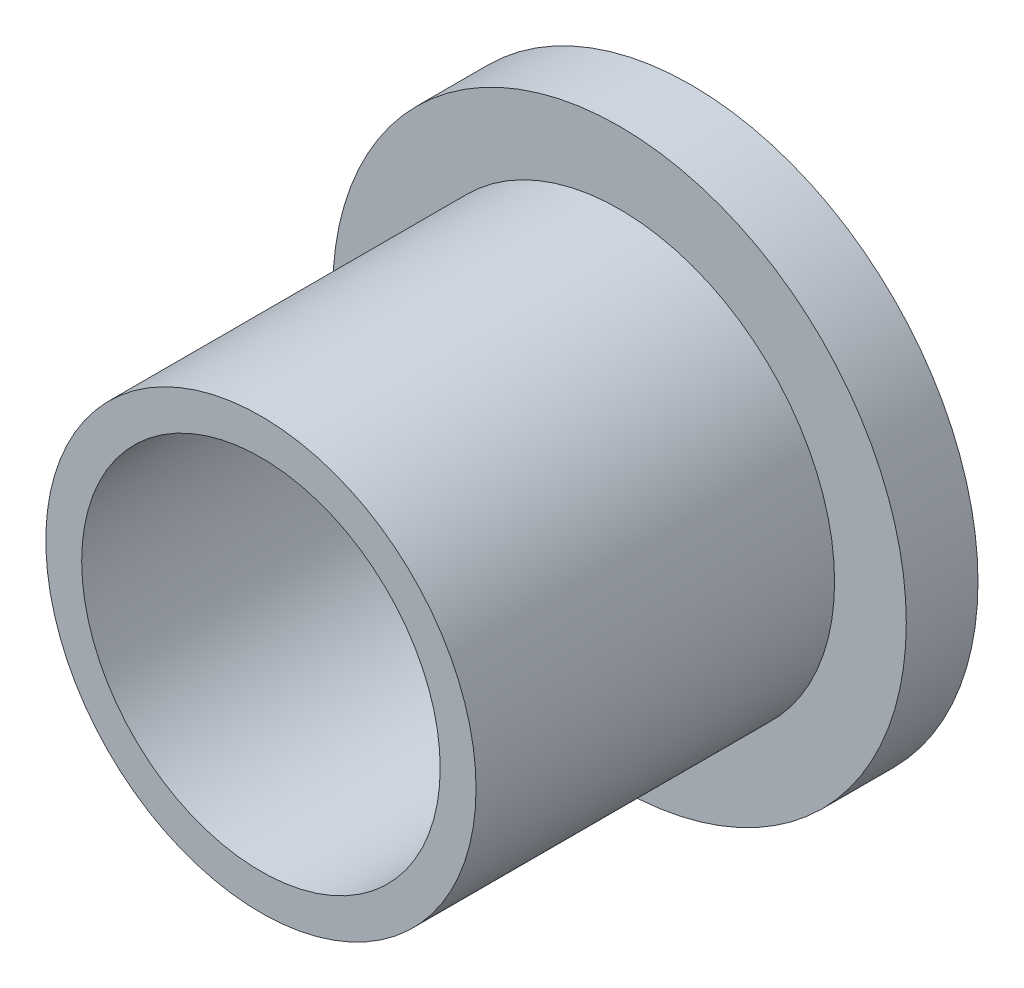
ISO-10303-21;
HEADER;
FILE_DESCRIPTION(('STEP AP214'),'2;1');
FILE_NAME('part.step','',(''),(''),'','','');
FILE_SCHEMA(('AUTOMOTIVE_DESIGN { 1 0 10303 214 1 1 1 1 }'));
ENDSEC;
DATA;
#1=APPLICATION_CONTEXT('core data for automotive mechanical design processes');
#2=APPLICATION_PROTOCOL_DEFINITION('international standard','automotive_design',2000,#1);
#3=PRODUCT_CONTEXT('',#1,'mechanical');
#4=PRODUCT('Part','Part','',(#3));
#5=PRODUCT_RELATED_PRODUCT_CATEGORY('part','',(#4));
#6=PRODUCT_DEFINITION_FORMATION('','',#4);
#7=PRODUCT_DEFINITION_CONTEXT('part definition',#1,'design');
#8=PRODUCT_DEFINITION('design','',#6,#7);
#9=PRODUCT_DEFINITION_SHAPE('','',#8);
#10=(LENGTH_UNIT() NAMED_UNIT(*) SI_UNIT(.MILLI.,.METRE.));
#11=(NAMED_UNIT(*) PLANE_ANGLE_UNIT() SI_UNIT($,.RADIAN.));
#12=(NAMED_UNIT(*) SI_UNIT($,.STERADIAN.) SOLID_ANGLE_UNIT());
#13=UNCERTAINTY_MEASURE_WITH_UNIT(LENGTH_MEASURE(1.E-05),#10,'distance_accuracy_value','');
#14=(GEOMETRIC_REPRESENTATION_CONTEXT(3) GLOBAL_UNCERTAINTY_ASSIGNED_CONTEXT((#13)) GLOBAL_UNIT_ASSIGNED_CONTEXT((#10,
#11,#12)) REPRESENTATION_CONTEXT('',''));
#15=CARTESIAN_POINT('',(0.,0.,0.));
#16=DIRECTION('',(0.,0.,1.));
#17=DIRECTION('',(1.,0.,0.));
#18=AXIS2_PLACEMENT_3D('',#15,#16,#17);
#19=CARTESIAN_POINT('',(0.,0.,10.));
#20=DIRECTION('',(0.,0.,1.));
#21=DIRECTION('',(1.,0.,0.));
#22=AXIS2_PLACEMENT_3D('',#19,#20,#21);
#23=PLANE('',#22);
#24=CARTESIAN_POINT('',(0.,0.,10.));
#25=DIRECTION('',(0.,0.,1.));
#26=DIRECTION('',(1.,0.,0.));
#27=AXIS2_PLACEMENT_3D('',#24,#25,#26);
#28=CIRCLE('',#27,40.);
#29=CARTESIAN_POINT('',(40.,0.,10.));
#30=VERTEX_POINT('',#29);
#31=EDGE_CURVE('E38',#30,#30,#28,.T.);
#32=ORIENTED_EDGE('',*,*,#31,.T.);
#33=EDGE_LOOP('',(#32));
#34=FACE_BOUND('',#33,.T.);
#35=CARTESIAN_POINT('',(0.,0.,10.));
#36=DIRECTION('',(0.,0.,1.));
#37=DIRECTION('',(1.,0.,0.));
#38=AXIS2_PLACEMENT_3D('',#35,#36,#37);
#39=CIRCLE('',#38,30.);
#40=CARTESIAN_POINT('',(30.,0.,10.));
#41=VERTEX_POINT('',#40);
#42=EDGE_CURVE('E49',#41,#41,#39,.T.);
#43=ORIENTED_EDGE('',*,*,#42,.F.);
#44=EDGE_LOOP('',(#43));
#45=FACE_BOUND('',#44,.T.);
#46=ADVANCED_FACE('F31',(#34,#45),#23,.T.);
#47=CARTESIAN_POINT('',(0.,0.,10.));
#48=DIRECTION('',(0.,0.,-1.));
#49=DIRECTION('',(-1.,0.,0.));
#50=AXIS2_PLACEMENT_3D('',#47,#48,#49);
#51=CYLINDRICAL_SURFACE('',#50,40.);
#52=ORIENTED_EDGE('',*,*,#31,.F.);
#53=EDGE_LOOP('',(#52));
#54=FACE_BOUND('',#53,.T.);
#55=CARTESIAN_POINT('',(0.,0.,0.));
#56=DIRECTION('',(0.,0.,1.));
#57=DIRECTION('',(1.,0.,0.));
#58=AXIS2_PLACEMENT_3D('',#55,#56,#57);
#59=CIRCLE('',#58,40.);
#60=CARTESIAN_POINT('',(40.,0.,0.));
#61=VERTEX_POINT('',#60);
#62=EDGE_CURVE('E42',#61,#61,#59,.T.);
#63=ORIENTED_EDGE('',*,*,#62,.T.);
#64=EDGE_LOOP('',(#63));
#65=FACE_BOUND('',#64,.T.);
#66=ADVANCED_FACE('F33',(#54,#65),#51,.T.);
#67=CARTESIAN_POINT('',(0.,0.,0.));
#68=DIRECTION('',(0.,0.,1.));
#69=DIRECTION('',(1.,0.,0.));
#70=AXIS2_PLACEMENT_3D('',#67,#68,#69);
#71=PLANE('',#70);
#72=ORIENTED_EDGE('',*,*,#62,.F.);
#73=EDGE_LOOP('',(#72));
#74=FACE_BOUND('',#73,.T.);
#75=ADVANCED_FACE('F63',(#74),#71,.F.);
#76=CARTESIAN_POINT('',(0.,0.,60.));
#77=DIRECTION('',(0.,0.,1.));
#78=DIRECTION('',(1.,0.,0.));
#79=AXIS2_PLACEMENT_3D('',#76,#77,#78);
#80=PLANE('',#79);
#81=CARTESIAN_POINT('',(0.,0.,60.));
#82=DIRECTION('',(0.,0.,1.));
#83=DIRECTION('',(1.,0.,0.));
#84=AXIS2_PLACEMENT_3D('',#81,#82,#83);
#85=CIRCLE('',#84,30.);
#86=CARTESIAN_POINT('',(30.,0.,60.));
#87=VERTEX_POINT('',#86);
#88=EDGE_CURVE('E47',#87,#87,#85,.T.);
#89=ORIENTED_EDGE('',*,*,#88,.T.);
#90=EDGE_LOOP('',(#89));
#91=FACE_BOUND('',#90,.T.);
#92=CARTESIAN_POINT('',(0.,0.,60.));
#93=DIRECTION('',(0.,0.,1.));
#94=DIRECTION('',(1.,0.,0.));
#95=AXIS2_PLACEMENT_3D('',#92,#93,#94);
#96=CIRCLE('',#95,25.);
#97=CARTESIAN_POINT('',(25.,0.,60.));
#98=VERTEX_POINT('',#97);
#99=EDGE_CURVE('E52',#98,#98,#96,.T.);
#100=ORIENTED_EDGE('',*,*,#99,.F.);
#101=EDGE_LOOP('',(#100));
#102=FACE_BOUND('',#101,.T.);
#103=ADVANCED_FACE('F60',(#91,#102),#80,.T.);
#104=CARTESIAN_POINT('',(0.,0.,60.));
#105=DIRECTION('',(0.,0.,-1.));
#106=DIRECTION('',(-1.,0.,0.));
#107=AXIS2_PLACEMENT_3D('',#104,#105,#106);
#108=CYLINDRICAL_SURFACE('',#107,30.);
#109=ORIENTED_EDGE('',*,*,#88,.F.);
#110=EDGE_LOOP('',(#109));
#111=FACE_BOUND('',#110,.T.);
#112=ORIENTED_EDGE('',*,*,#42,.T.);
#113=EDGE_LOOP('',(#112));
#114=FACE_BOUND('',#113,.T.);
#115=ADVANCED_FACE('F62',(#111,#114),#108,.T.);
#116=CARTESIAN_POINT('',(0.,0.,60.));
#117=DIRECTION('',(0.,0.,-1.));
#118=DIRECTION('',(-1.,0.,0.));
#119=AXIS2_PLACEMENT_3D('',#116,#117,#118);
#120=CYLINDRICAL_SURFACE('',#119,25.);
#121=ORIENTED_EDGE('',*,*,#99,.T.);
#122=EDGE_LOOP('',(#121));
#123=FACE_BOUND('',#122,.T.);
#124=CARTESIAN_POINT('',(0.,0.,10.));
#125=DIRECTION('',(0.,0.,1.));
#126=DIRECTION('',(1.,0.,0.));
#127=AXIS2_PLACEMENT_3D('',#124,#125,#126);
#128=CIRCLE('',#127,25.);
#129=CARTESIAN_POINT('',(25.,0.,10.));
#130=VERTEX_POINT('',#129);
#131=EDGE_CURVE('E10',#130,#130,#128,.F.);
#132=ORIENTED_EDGE('',*,*,#131,.T.);
#133=EDGE_LOOP('',(#132));
#134=FACE_BOUND('',#133,.T.);
#135=ADVANCED_FACE('F58',(#123,#134),#120,.F.);
#136=ORIENTED_EDGE('',*,*,#131,.F.);
#137=EDGE_LOOP('',(#136));
#138=FACE_BOUND('',#137,.T.);
#139=ADVANCED_FACE('F76',(#138),#23,.T.);
#140=CLOSED_SHELL('',(#46,#66,#75,#103,#115,#135,#139));
#141=MANIFOLD_SOLID_BREP('B2',#140);
#142=ADVANCED_BREP_SHAPE_REPRESENTATION('',(#18,#141),#14);
#143=SHAPE_DEFINITION_REPRESENTATION(#9,#142);
ENDSEC;
END-ISO-10303-21;
